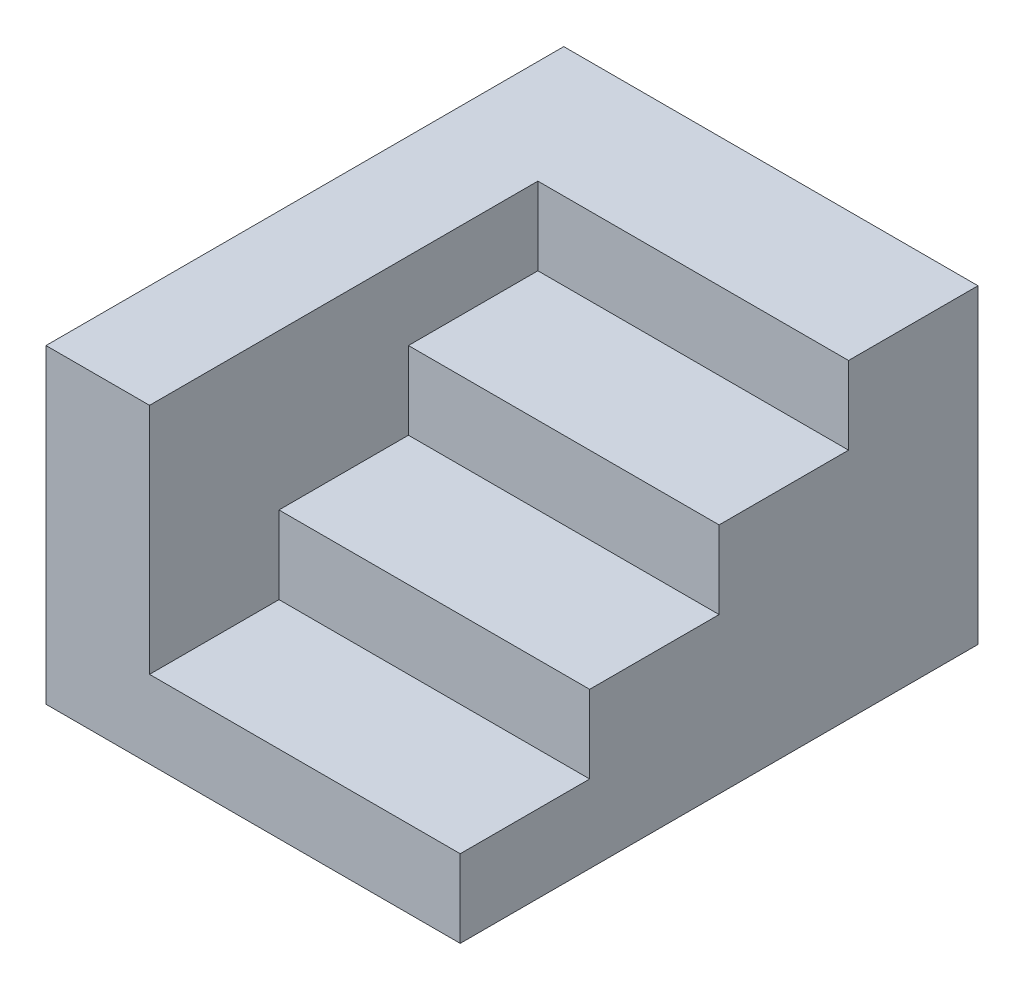
ISO-10303-21;
HEADER;
FILE_DESCRIPTION(('STEP AP214'),'2;1');
FILE_NAME('part.step','',(''),(''),'','','');
FILE_SCHEMA(('AUTOMOTIVE_DESIGN { 1 0 10303 214 1 1 1 1 }'));
ENDSEC;
DATA;
#1=APPLICATION_CONTEXT('core data for automotive mechanical design processes');
#2=APPLICATION_PROTOCOL_DEFINITION('international standard','automotive_design',2000,#1);
#3=PRODUCT_CONTEXT('',#1,'mechanical');
#4=PRODUCT('Part','Part','',(#3));
#5=PRODUCT_RELATED_PRODUCT_CATEGORY('part','',(#4));
#6=PRODUCT_DEFINITION_FORMATION('','',#4);
#7=PRODUCT_DEFINITION_CONTEXT('part definition',#1,'design');
#8=PRODUCT_DEFINITION('design','',#6,#7);
#9=PRODUCT_DEFINITION_SHAPE('','',#8);
#10=(LENGTH_UNIT() NAMED_UNIT(*) SI_UNIT(.MILLI.,.METRE.));
#11=(NAMED_UNIT(*) PLANE_ANGLE_UNIT() SI_UNIT($,.RADIAN.));
#12=(NAMED_UNIT(*) SI_UNIT($,.STERADIAN.) SOLID_ANGLE_UNIT());
#13=UNCERTAINTY_MEASURE_WITH_UNIT(LENGTH_MEASURE(1.E-05),#10,'distance_accuracy_value','');
#14=(GEOMETRIC_REPRESENTATION_CONTEXT(3) GLOBAL_UNCERTAINTY_ASSIGNED_CONTEXT((#13)) GLOBAL_UNIT_ASSIGNED_CONTEXT((#10,
#11,#12)) REPRESENTATION_CONTEXT('',''));
#15=CARTESIAN_POINT('',(0.,0.,0.));
#16=DIRECTION('',(0.,0.,1.));
#17=DIRECTION('',(1.,0.,0.));
#18=AXIS2_PLACEMENT_3D('',#15,#16,#17);
#19=CARTESIAN_POINT('',(20.,0.,-100.));
#20=DIRECTION('',(0.,0.,1.));
#21=DIRECTION('',(1.,0.,0.));
#22=AXIS2_PLACEMENT_3D('',#19,#20,#21);
#23=PLANE('',#22);
#24=DIRECTION('',(0.,1.,0.));
#25=VECTOR('',#24,1.);
#26=CARTESIAN_POINT('',(0.,0.,-100.));
#27=LINE('',#26,#25);
#28=CARTESIAN_POINT('',(0.,0.,-100.));
#29=VERTEX_POINT('',#28);
#30=CARTESIAN_POINT('',(0.,60.,-100.));
#31=VERTEX_POINT('',#30);
#32=EDGE_CURVE('E92',#29,#31,#27,.T.);
#33=ORIENTED_EDGE('',*,*,#32,.T.);
#34=DIRECTION('',(-1.,0.,0.));
#35=VECTOR('',#34,1.);
#36=CARTESIAN_POINT('',(20.,60.,-100.));
#37=LINE('',#36,#35);
#38=CARTESIAN_POINT('',(80.,60.,-100.));
#39=VERTEX_POINT('',#38);
#40=EDGE_CURVE('E11',#39,#31,#37,.T.);
#41=ORIENTED_EDGE('',*,*,#40,.F.);
#42=DIRECTION('',(0.,1.,0.));
#43=VECTOR('',#42,1.);
#44=CARTESIAN_POINT('',(80.,0.,-100.));
#45=LINE('',#44,#43);
#46=CARTESIAN_POINT('',(80.,0.,-100.));
#47=VERTEX_POINT('',#46);
#48=EDGE_CURVE('E153',#47,#39,#45,.T.);
#49=ORIENTED_EDGE('',*,*,#48,.F.);
#50=DIRECTION('',(-1.,0.,0.));
#51=VECTOR('',#50,1.);
#52=CARTESIAN_POINT('',(20.,0.,-100.));
#53=LINE('',#52,#51);
#54=EDGE_CURVE('E85',#47,#29,#53,.T.);
#55=ORIENTED_EDGE('',*,*,#54,.T.);
#56=EDGE_LOOP('',(#33,#41,#49,#55));
#57=FACE_BOUND('',#56,.T.);
#58=ADVANCED_FACE('F41',(#57),#23,.F.);
#59=CARTESIAN_POINT('',(20.,60.,0.));
#60=DIRECTION('',(0.,1.,0.));
#61=DIRECTION('',(0.,0.,1.));
#62=AXIS2_PLACEMENT_3D('',#59,#60,#61);
#63=PLANE('',#62);
#64=DIRECTION('',(0.,0.,-1.));
#65=VECTOR('',#64,1.);
#66=CARTESIAN_POINT('',(20.,60.,0.));
#67=LINE('',#66,#65);
#68=CARTESIAN_POINT('',(20.,60.,0.));
#69=VERTEX_POINT('',#68);
#70=CARTESIAN_POINT('',(20.,60.,-75.));
#71=VERTEX_POINT('',#70);
#72=EDGE_CURVE('E93',#69,#71,#67,.T.);
#73=ORIENTED_EDGE('',*,*,#72,.T.);
#74=DIRECTION('',(-1.,0.,0.));
#75=VECTOR('',#74,1.);
#76=CARTESIAN_POINT('',(80.,60.,-75.));
#77=LINE('',#76,#75);
#78=CARTESIAN_POINT('',(80.,60.,-75.));
#79=VERTEX_POINT('',#78);
#80=EDGE_CURVE('E148',#79,#71,#77,.T.);
#81=ORIENTED_EDGE('',*,*,#80,.F.);
#82=DIRECTION('',(0.,0.,-1.));
#83=VECTOR('',#82,1.);
#84=CARTESIAN_POINT('',(80.,60.,0.));
#85=LINE('',#84,#83);
#86=EDGE_CURVE('E150',#79,#39,#85,.T.);
#87=ORIENTED_EDGE('',*,*,#86,.T.);
#88=ORIENTED_EDGE('',*,*,#40,.T.);
#89=DIRECTION('',(0.,0.,-1.));
#90=VECTOR('',#89,1.);
#91=CARTESIAN_POINT('',(0.,60.,0.));
#92=LINE('',#91,#90);
#93=CARTESIAN_POINT('',(0.,60.,0.));
#94=VERTEX_POINT('',#93);
#95=EDGE_CURVE('E97',#94,#31,#92,.T.);
#96=ORIENTED_EDGE('',*,*,#95,.F.);
#97=DIRECTION('',(-1.,0.,0.));
#98=VECTOR('',#97,1.);
#99=CARTESIAN_POINT('',(20.,60.,0.));
#100=LINE('',#99,#98);
#101=EDGE_CURVE('E49',#69,#94,#100,.T.);
#102=ORIENTED_EDGE('',*,*,#101,.F.);
#103=EDGE_LOOP('',(#73,#81,#87,#88,#96,#102));
#104=FACE_BOUND('',#103,.T.);
#105=ADVANCED_FACE('F189',(#104),#63,.T.);
#106=CARTESIAN_POINT('',(20.,0.,0.));
#107=DIRECTION('',(0.,0.,1.));
#108=DIRECTION('',(1.,0.,0.));
#109=AXIS2_PLACEMENT_3D('',#106,#107,#108);
#110=PLANE('',#109);
#111=ORIENTED_EDGE('',*,*,#101,.T.);
#112=DIRECTION('',(0.,1.,0.));
#113=VECTOR('',#112,1.);
#114=CARTESIAN_POINT('',(0.,0.,0.));
#115=LINE('',#114,#113);
#116=CARTESIAN_POINT('',(0.,0.,0.));
#117=VERTEX_POINT('',#116);
#118=EDGE_CURVE('E90',#117,#94,#115,.T.);
#119=ORIENTED_EDGE('',*,*,#118,.F.);
#120=DIRECTION('',(-1.,0.,0.));
#121=VECTOR('',#120,1.);
#122=CARTESIAN_POINT('',(20.,0.,0.));
#123=LINE('',#122,#121);
#124=CARTESIAN_POINT('',(80.,0.,0.));
#125=VERTEX_POINT('',#124);
#126=EDGE_CURVE('E73',#125,#117,#123,.T.);
#127=ORIENTED_EDGE('',*,*,#126,.F.);
#128=DIRECTION('',(0.,1.,0.));
#129=VECTOR('',#128,1.);
#130=CARTESIAN_POINT('',(80.,0.,0.));
#131=LINE('',#130,#129);
#132=CARTESIAN_POINT('',(80.,15.,0.));
#133=VERTEX_POINT('',#132);
#134=EDGE_CURVE('E157',#125,#133,#131,.T.);
#135=ORIENTED_EDGE('',*,*,#134,.T.);
#136=DIRECTION('',(-1.,0.,0.));
#137=VECTOR('',#136,1.);
#138=CARTESIAN_POINT('',(80.,15.,0.));
#139=LINE('',#138,#137);
#140=CARTESIAN_POINT('',(20.,15.,0.));
#141=VERTEX_POINT('',#140);
#142=EDGE_CURVE('E146',#133,#141,#139,.T.);
#143=ORIENTED_EDGE('',*,*,#142,.T.);
#144=DIRECTION('',(0.,1.,0.));
#145=VECTOR('',#144,1.);
#146=CARTESIAN_POINT('',(20.,0.,0.));
#147=LINE('',#146,#145);
#148=EDGE_CURVE('E56',#141,#69,#147,.T.);
#149=ORIENTED_EDGE('',*,*,#148,.T.);
#150=EDGE_LOOP('',(#111,#119,#127,#135,#143,#149));
#151=FACE_BOUND('',#150,.T.);
#152=ADVANCED_FACE('F95',(#151),#110,.T.);
#153=CARTESIAN_POINT('',(20.,0.,0.));
#154=DIRECTION('',(0.,1.,0.));
#155=DIRECTION('',(0.,0.,1.));
#156=AXIS2_PLACEMENT_3D('',#153,#154,#155);
#157=PLANE('',#156);
#158=DIRECTION('',(0.,0.,-1.));
#159=VECTOR('',#158,1.);
#160=CARTESIAN_POINT('',(0.,0.,0.));
#161=LINE('',#160,#159);
#162=EDGE_CURVE('E77',#117,#29,#161,.T.);
#163=ORIENTED_EDGE('',*,*,#162,.T.);
#164=ORIENTED_EDGE('',*,*,#54,.F.);
#165=DIRECTION('',(0.,0.,-1.));
#166=VECTOR('',#165,1.);
#167=CARTESIAN_POINT('',(80.,0.,0.));
#168=LINE('',#167,#166);
#169=EDGE_CURVE('E81',#125,#47,#168,.T.);
#170=ORIENTED_EDGE('',*,*,#169,.F.);
#171=ORIENTED_EDGE('',*,*,#126,.T.);
#172=EDGE_LOOP('',(#163,#164,#170,#171));
#173=FACE_BOUND('',#172,.T.);
#174=ADVANCED_FACE('F75',(#173),#157,.F.);
#175=CARTESIAN_POINT('',(20.,0.,0.));
#176=DIRECTION('',(1.,0.,0.));
#177=DIRECTION('',(0.,0.,-1.));
#178=AXIS2_PLACEMENT_3D('',#175,#176,#177);
#179=PLANE('',#178);
#180=DIRECTION('',(0.,-1.,0.));
#181=VECTOR('',#180,1.);
#182=CARTESIAN_POINT('',(20.,0.,-75.));
#183=LINE('',#182,#181);
#184=CARTESIAN_POINT('',(20.,45.,-75.));
#185=VERTEX_POINT('',#184);
#186=EDGE_CURVE('E108',#71,#185,#183,.T.);
#187=ORIENTED_EDGE('',*,*,#186,.F.);
#188=ORIENTED_EDGE('',*,*,#72,.F.);
#189=ORIENTED_EDGE('',*,*,#148,.F.);
#190=DIRECTION('',(0.,0.,1.));
#191=VECTOR('',#190,1.);
#192=CARTESIAN_POINT('',(20.,15.,0.));
#193=LINE('',#192,#191);
#194=CARTESIAN_POINT('',(20.,15.,-25.));
#195=VERTEX_POINT('',#194);
#196=EDGE_CURVE('E129',#195,#141,#193,.T.);
#197=ORIENTED_EDGE('',*,*,#196,.F.);
#198=DIRECTION('',(0.,-1.,0.));
#199=VECTOR('',#198,1.);
#200=CARTESIAN_POINT('',(20.,0.,-25.));
#201=LINE('',#200,#199);
#202=CARTESIAN_POINT('',(20.,30.,-25.));
#203=VERTEX_POINT('',#202);
#204=EDGE_CURVE('E126',#203,#195,#201,.T.);
#205=ORIENTED_EDGE('',*,*,#204,.F.);
#206=DIRECTION('',(0.,0.,1.));
#207=VECTOR('',#206,1.);
#208=CARTESIAN_POINT('',(20.,30.,0.));
#209=LINE('',#208,#207);
#210=CARTESIAN_POINT('',(20.,30.,-50.));
#211=VERTEX_POINT('',#210);
#212=EDGE_CURVE('E123',#211,#203,#209,.T.);
#213=ORIENTED_EDGE('',*,*,#212,.F.);
#214=DIRECTION('',(0.,-1.,0.));
#215=VECTOR('',#214,1.);
#216=CARTESIAN_POINT('',(20.,0.,-50.));
#217=LINE('',#216,#215);
#218=CARTESIAN_POINT('',(20.,45.,-50.));
#219=VERTEX_POINT('',#218);
#220=EDGE_CURVE('E118',#219,#211,#217,.T.);
#221=ORIENTED_EDGE('',*,*,#220,.F.);
#222=DIRECTION('',(0.,0.,1.));
#223=VECTOR('',#222,1.);
#224=CARTESIAN_POINT('',(20.,45.,0.));
#225=LINE('',#224,#223);
#226=EDGE_CURVE('E111',#185,#219,#225,.T.);
#227=ORIENTED_EDGE('',*,*,#226,.F.);
#228=EDGE_LOOP('',(#187,#188,#189,#197,#205,#213,#221,#227));
#229=FACE_BOUND('',#228,.T.);
#230=ADVANCED_FACE('F216',(#229),#179,.T.);
#231=CARTESIAN_POINT('',(0.,0.,0.));
#232=DIRECTION('',(1.,0.,0.));
#233=DIRECTION('',(0.,0.,-1.));
#234=AXIS2_PLACEMENT_3D('',#231,#232,#233);
#235=PLANE('',#234);
#236=ORIENTED_EDGE('',*,*,#95,.T.);
#237=ORIENTED_EDGE('',*,*,#32,.F.);
#238=ORIENTED_EDGE('',*,*,#162,.F.);
#239=ORIENTED_EDGE('',*,*,#118,.T.);
#240=EDGE_LOOP('',(#236,#237,#238,#239));
#241=FACE_BOUND('',#240,.T.);
#242=ADVANCED_FACE('F89',(#241),#235,.F.);
#243=CARTESIAN_POINT('',(80.,0.,-75.));
#244=DIRECTION('',(0.,0.,1.));
#245=DIRECTION('',(1.,0.,0.));
#246=AXIS2_PLACEMENT_3D('',#243,#244,#245);
#247=PLANE('',#246);
#248=ORIENTED_EDGE('',*,*,#80,.T.);
#249=ORIENTED_EDGE('',*,*,#186,.T.);
#250=DIRECTION('',(-1.,0.,0.));
#251=VECTOR('',#250,1.);
#252=CARTESIAN_POINT('',(80.,45.,-75.));
#253=LINE('',#252,#251);
#254=CARTESIAN_POINT('',(80.,45.,-75.));
#255=VERTEX_POINT('',#254);
#256=EDGE_CURVE('E132',#255,#185,#253,.T.);
#257=ORIENTED_EDGE('',*,*,#256,.F.);
#258=DIRECTION('',(0.,1.,0.));
#259=VECTOR('',#258,1.);
#260=CARTESIAN_POINT('',(80.,0.,-75.));
#261=LINE('',#260,#259);
#262=EDGE_CURVE('E174',#255,#79,#261,.T.);
#263=ORIENTED_EDGE('',*,*,#262,.T.);
#264=EDGE_LOOP('',(#248,#249,#257,#263));
#265=FACE_BOUND('',#264,.T.);
#266=ADVANCED_FACE('F179',(#265),#247,.T.);
#267=CARTESIAN_POINT('',(80.,45.,0.));
#268=DIRECTION('',(0.,1.,0.));
#269=DIRECTION('',(0.,0.,1.));
#270=AXIS2_PLACEMENT_3D('',#267,#268,#269);
#271=PLANE('',#270);
#272=ORIENTED_EDGE('',*,*,#256,.T.);
#273=ORIENTED_EDGE('',*,*,#226,.T.);
#274=DIRECTION('',(-1.,0.,0.));
#275=VECTOR('',#274,1.);
#276=CARTESIAN_POINT('',(80.,45.,-50.));
#277=LINE('',#276,#275);
#278=CARTESIAN_POINT('',(80.,45.,-50.));
#279=VERTEX_POINT('',#278);
#280=EDGE_CURVE('E134',#279,#219,#277,.T.);
#281=ORIENTED_EDGE('',*,*,#280,.F.);
#282=DIRECTION('',(0.,0.,-1.));
#283=VECTOR('',#282,1.);
#284=CARTESIAN_POINT('',(80.,45.,0.));
#285=LINE('',#284,#283);
#286=EDGE_CURVE('E171',#279,#255,#285,.T.);
#287=ORIENTED_EDGE('',*,*,#286,.T.);
#288=EDGE_LOOP('',(#272,#273,#281,#287));
#289=FACE_BOUND('',#288,.T.);
#290=ADVANCED_FACE('F207',(#289),#271,.T.);
#291=CARTESIAN_POINT('',(80.,0.,-50.));
#292=DIRECTION('',(0.,0.,1.));
#293=DIRECTION('',(1.,0.,0.));
#294=AXIS2_PLACEMENT_3D('',#291,#292,#293);
#295=PLANE('',#294);
#296=ORIENTED_EDGE('',*,*,#280,.T.);
#297=ORIENTED_EDGE('',*,*,#220,.T.);
#298=DIRECTION('',(-1.,0.,0.));
#299=VECTOR('',#298,1.);
#300=CARTESIAN_POINT('',(80.,30.,-50.));
#301=LINE('',#300,#299);
#302=CARTESIAN_POINT('',(80.,30.,-50.));
#303=VERTEX_POINT('',#302);
#304=EDGE_CURVE('E137',#303,#211,#301,.T.);
#305=ORIENTED_EDGE('',*,*,#304,.F.);
#306=DIRECTION('',(0.,1.,0.));
#307=VECTOR('',#306,1.);
#308=CARTESIAN_POINT('',(80.,0.,-50.));
#309=LINE('',#308,#307);
#310=EDGE_CURVE('E168',#303,#279,#309,.T.);
#311=ORIENTED_EDGE('',*,*,#310,.T.);
#312=EDGE_LOOP('',(#296,#297,#305,#311));
#313=FACE_BOUND('',#312,.T.);
#314=ADVANCED_FACE('F212',(#313),#295,.T.);
#315=CARTESIAN_POINT('',(80.,30.,0.));
#316=DIRECTION('',(0.,1.,0.));
#317=DIRECTION('',(0.,0.,1.));
#318=AXIS2_PLACEMENT_3D('',#315,#316,#317);
#319=PLANE('',#318);
#320=ORIENTED_EDGE('',*,*,#304,.T.);
#321=ORIENTED_EDGE('',*,*,#212,.T.);
#322=DIRECTION('',(-1.,0.,0.));
#323=VECTOR('',#322,1.);
#324=CARTESIAN_POINT('',(80.,30.,-25.));
#325=LINE('',#324,#323);
#326=CARTESIAN_POINT('',(80.,30.,-25.));
#327=VERTEX_POINT('',#326);
#328=EDGE_CURVE('E140',#327,#203,#325,.T.);
#329=ORIENTED_EDGE('',*,*,#328,.F.);
#330=DIRECTION('',(0.,0.,-1.));
#331=VECTOR('',#330,1.);
#332=CARTESIAN_POINT('',(80.,30.,0.));
#333=LINE('',#332,#331);
#334=EDGE_CURVE('E165',#327,#303,#333,.T.);
#335=ORIENTED_EDGE('',*,*,#334,.T.);
#336=EDGE_LOOP('',(#320,#321,#329,#335));
#337=FACE_BOUND('',#336,.T.);
#338=ADVANCED_FACE('F221',(#337),#319,.T.);
#339=CARTESIAN_POINT('',(80.,0.,-25.));
#340=DIRECTION('',(0.,0.,1.));
#341=DIRECTION('',(0.,-1.,0.));
#342=AXIS2_PLACEMENT_3D('',#339,#340,#341);
#343=PLANE('',#342);
#344=ORIENTED_EDGE('',*,*,#328,.T.);
#345=ORIENTED_EDGE('',*,*,#204,.T.);
#346=DIRECTION('',(-1.,0.,0.));
#347=VECTOR('',#346,1.);
#348=CARTESIAN_POINT('',(80.,15.,-25.));
#349=LINE('',#348,#347);
#350=CARTESIAN_POINT('',(80.,15.,-25.));
#351=VERTEX_POINT('',#350);
#352=EDGE_CURVE('E143',#351,#195,#349,.T.);
#353=ORIENTED_EDGE('',*,*,#352,.F.);
#354=DIRECTION('',(0.,1.,0.));
#355=VECTOR('',#354,1.);
#356=CARTESIAN_POINT('',(80.,0.,-25.));
#357=LINE('',#356,#355);
#358=EDGE_CURVE('E162',#351,#327,#357,.T.);
#359=ORIENTED_EDGE('',*,*,#358,.T.);
#360=EDGE_LOOP('',(#344,#345,#353,#359));
#361=FACE_BOUND('',#360,.T.);
#362=ADVANCED_FACE('F225',(#361),#343,.T.);
#363=CARTESIAN_POINT('',(80.,15.,0.));
#364=DIRECTION('',(0.,1.,0.));
#365=DIRECTION('',(0.,0.,1.));
#366=AXIS2_PLACEMENT_3D('',#363,#364,#365);
#367=PLANE('',#366);
#368=ORIENTED_EDGE('',*,*,#352,.T.);
#369=ORIENTED_EDGE('',*,*,#196,.T.);
#370=ORIENTED_EDGE('',*,*,#142,.F.);
#371=DIRECTION('',(0.,0.,-1.));
#372=VECTOR('',#371,1.);
#373=CARTESIAN_POINT('',(80.,15.,0.));
#374=LINE('',#373,#372);
#375=EDGE_CURVE('E159',#133,#351,#374,.T.);
#376=ORIENTED_EDGE('',*,*,#375,.T.);
#377=EDGE_LOOP('',(#368,#369,#370,#376));
#378=FACE_BOUND('',#377,.T.);
#379=ADVANCED_FACE('F236',(#378),#367,.T.);
#380=CARTESIAN_POINT('',(80.,0.,0.));
#381=DIRECTION('',(1.,0.,0.));
#382=DIRECTION('',(0.,0.,-1.));
#383=AXIS2_PLACEMENT_3D('',#380,#381,#382);
#384=PLANE('',#383);
#385=ORIENTED_EDGE('',*,*,#262,.F.);
#386=ORIENTED_EDGE('',*,*,#286,.F.);
#387=ORIENTED_EDGE('',*,*,#310,.F.);
#388=ORIENTED_EDGE('',*,*,#334,.F.);
#389=ORIENTED_EDGE('',*,*,#358,.F.);
#390=ORIENTED_EDGE('',*,*,#375,.F.);
#391=ORIENTED_EDGE('',*,*,#134,.F.);
#392=ORIENTED_EDGE('',*,*,#169,.T.);
#393=ORIENTED_EDGE('',*,*,#48,.T.);
#394=ORIENTED_EDGE('',*,*,#86,.F.);
#395=EDGE_LOOP('',(#385,#386,#387,#388,#389,#390,#391,#392,#393,#394));
#396=FACE_BOUND('',#395,.T.);
#397=ADVANCED_FACE('F187',(#396),#384,.T.);
#398=CLOSED_SHELL('',(#58,#105,#152,#174,#230,#242,#266,#290,#314,#338,#362,#379,#397));
#399=MANIFOLD_SOLID_BREP('B2',#398);
#400=ADVANCED_BREP_SHAPE_REPRESENTATION('',(#18,#399),#14);
#401=SHAPE_DEFINITION_REPRESENTATION(#9,#400);
ENDSEC;
END-ISO-10303-21;
